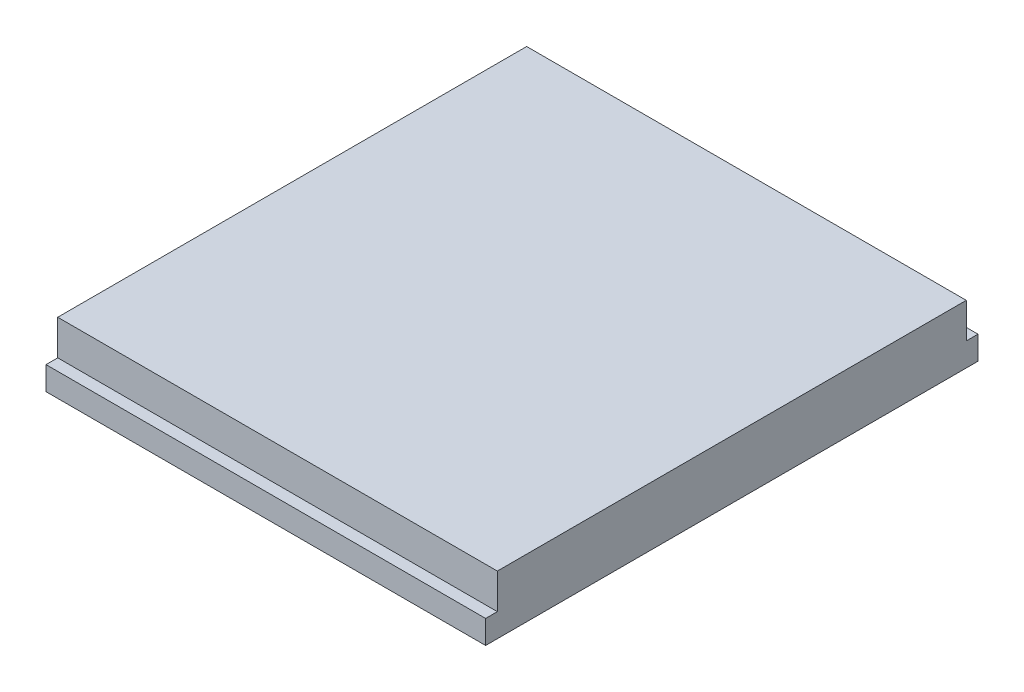
ISO-10303-21;
HEADER;
FILE_DESCRIPTION(('STEP AP214'),'2;1');
FILE_NAME('part.step','',(''),(''),'','','');
FILE_SCHEMA(('AUTOMOTIVE_DESIGN { 1 0 10303 214 1 1 1 1 }'));
ENDSEC;
DATA;
#1=APPLICATION_CONTEXT('core data for automotive mechanical design processes');
#2=APPLICATION_PROTOCOL_DEFINITION('international standard','automotive_design',2000,#1);
#3=PRODUCT_CONTEXT('',#1,'mechanical');
#4=PRODUCT('Part','Part','',(#3));
#5=PRODUCT_RELATED_PRODUCT_CATEGORY('part','',(#4));
#6=PRODUCT_DEFINITION_FORMATION('','',#4);
#7=PRODUCT_DEFINITION_CONTEXT('part definition',#1,'design');
#8=PRODUCT_DEFINITION('design','',#6,#7);
#9=PRODUCT_DEFINITION_SHAPE('','',#8);
#10=(LENGTH_UNIT() NAMED_UNIT(*) SI_UNIT(.MILLI.,.METRE.));
#11=(NAMED_UNIT(*) PLANE_ANGLE_UNIT() SI_UNIT($,.RADIAN.));
#12=(NAMED_UNIT(*) SI_UNIT($,.STERADIAN.) SOLID_ANGLE_UNIT());
#13=UNCERTAINTY_MEASURE_WITH_UNIT(LENGTH_MEASURE(1.E-05),#10,'distance_accuracy_value','');
#14=(GEOMETRIC_REPRESENTATION_CONTEXT(3) GLOBAL_UNCERTAINTY_ASSIGNED_CONTEXT((#13)) GLOBAL_UNIT_ASSIGNED_CONTEXT((#10,
#11,#12)) REPRESENTATION_CONTEXT('',''));
#15=CARTESIAN_POINT('',(0.,0.,0.));
#16=DIRECTION('',(0.,0.,1.));
#17=DIRECTION('',(1.,0.,0.));
#18=AXIS2_PLACEMENT_3D('',#15,#16,#17);
#19=CARTESIAN_POINT('',(-18.75,5.,-21.));
#20=DIRECTION('',(0.,0.,-1.));
#21=DIRECTION('',(-1.,0.,0.));
#22=AXIS2_PLACEMENT_3D('',#19,#20,#21);
#23=PLANE('',#22);
#24=DIRECTION('',(0.,-1.,0.));
#25=VECTOR('',#24,1.);
#26=CARTESIAN_POINT('',(-18.75,5.,-21.));
#27=LINE('',#26,#25);
#28=CARTESIAN_POINT('',(-18.75,2.,-21.));
#29=VERTEX_POINT('',#28);
#30=CARTESIAN_POINT('',(-18.75,0.,-21.));
#31=VERTEX_POINT('',#30);
#32=EDGE_CURVE('E156',#29,#31,#27,.T.);
#33=ORIENTED_EDGE('',*,*,#32,.F.);
#34=DIRECTION('',(-1.,0.,0.));
#35=VECTOR('',#34,1.);
#36=CARTESIAN_POINT('',(-18.75,2.,-21.));
#37=LINE('',#36,#35);
#38=CARTESIAN_POINT('',(18.75,2.,-21.));
#39=VERTEX_POINT('',#38);
#40=EDGE_CURVE('E109',#39,#29,#37,.T.);
#41=ORIENTED_EDGE('',*,*,#40,.F.);
#42=DIRECTION('',(0.,-1.,0.));
#43=VECTOR('',#42,1.);
#44=CARTESIAN_POINT('',(18.75,5.,-21.));
#45=LINE('',#44,#43);
#46=CARTESIAN_POINT('',(18.75,0.,-21.));
#47=VERTEX_POINT('',#46);
#48=EDGE_CURVE('E41',#39,#47,#45,.T.);
#49=ORIENTED_EDGE('',*,*,#48,.T.);
#50=DIRECTION('',(1.,0.,0.));
#51=VECTOR('',#50,1.);
#52=CARTESIAN_POINT('',(-18.75,0.,-21.));
#53=LINE('',#52,#51);
#54=EDGE_CURVE('E150',#31,#47,#53,.T.);
#55=ORIENTED_EDGE('',*,*,#54,.F.);
#56=EDGE_LOOP('',(#33,#41,#49,#55));
#57=FACE_BOUND('',#56,.T.);
#58=ADVANCED_FACE('F33',(#57),#23,.T.);
#59=CARTESIAN_POINT('',(-18.75,5.,21.));
#60=DIRECTION('',(0.,0.,-1.));
#61=DIRECTION('',(-1.,0.,0.));
#62=AXIS2_PLACEMENT_3D('',#59,#60,#61);
#63=PLANE('',#62);
#64=DIRECTION('',(0.,-1.,0.));
#65=VECTOR('',#64,1.);
#66=CARTESIAN_POINT('',(18.75,5.,21.));
#67=LINE('',#66,#65);
#68=CARTESIAN_POINT('',(18.75,2.,21.));
#69=VERTEX_POINT('',#68);
#70=CARTESIAN_POINT('',(18.75,0.,21.));
#71=VERTEX_POINT('',#70);
#72=EDGE_CURVE('E11',#69,#71,#67,.T.);
#73=ORIENTED_EDGE('',*,*,#72,.F.);
#74=DIRECTION('',(1.,0.,0.));
#75=VECTOR('',#74,1.);
#76=CARTESIAN_POINT('',(-18.75,2.,21.));
#77=LINE('',#76,#75);
#78=CARTESIAN_POINT('',(-18.75,2.,21.));
#79=VERTEX_POINT('',#78);
#80=EDGE_CURVE('E127',#79,#69,#77,.T.);
#81=ORIENTED_EDGE('',*,*,#80,.F.);
#82=DIRECTION('',(0.,-1.,0.));
#83=VECTOR('',#82,1.);
#84=CARTESIAN_POINT('',(-18.75,5.,21.));
#85=LINE('',#84,#83);
#86=CARTESIAN_POINT('',(-18.75,0.,21.));
#87=VERTEX_POINT('',#86);
#88=EDGE_CURVE('E144',#79,#87,#85,.T.);
#89=ORIENTED_EDGE('',*,*,#88,.T.);
#90=DIRECTION('',(1.,0.,0.));
#91=VECTOR('',#90,1.);
#92=CARTESIAN_POINT('',(-18.75,0.,21.));
#93=LINE('',#92,#91);
#94=EDGE_CURVE('E137',#87,#71,#93,.T.);
#95=ORIENTED_EDGE('',*,*,#94,.T.);
#96=EDGE_LOOP('',(#73,#81,#89,#95));
#97=FACE_BOUND('',#96,.T.);
#98=ADVANCED_FACE('F35',(#97),#63,.F.);
#99=CARTESIAN_POINT('',(18.75,5.,21.));
#100=DIRECTION('',(-1.,0.,0.));
#101=DIRECTION('',(0.,0.,1.));
#102=AXIS2_PLACEMENT_3D('',#99,#100,#101);
#103=PLANE('',#102);
#104=DIRECTION('',(0.,0.,-1.));
#105=VECTOR('',#104,1.);
#106=CARTESIAN_POINT('',(18.75,2.,-21.));
#107=LINE('',#106,#105);
#108=CARTESIAN_POINT('',(18.75,2.,-20.));
#109=VERTEX_POINT('',#108);
#110=EDGE_CURVE('E103',#109,#39,#107,.T.);
#111=ORIENTED_EDGE('',*,*,#110,.F.);
#112=DIRECTION('',(0.,1.,0.));
#113=VECTOR('',#112,1.);
#114=CARTESIAN_POINT('',(18.75,2.,-20.));
#115=LINE('',#114,#113);
#116=CARTESIAN_POINT('',(18.75,5.,-20.));
#117=VERTEX_POINT('',#116);
#118=EDGE_CURVE('E100',#109,#117,#115,.T.);
#119=ORIENTED_EDGE('',*,*,#118,.T.);
#120=DIRECTION('',(0.,0.,-1.));
#121=VECTOR('',#120,1.);
#122=CARTESIAN_POINT('',(18.75,5.,21.));
#123=LINE('',#122,#121);
#124=CARTESIAN_POINT('',(18.75,5.,20.));
#125=VERTEX_POINT('',#124);
#126=EDGE_CURVE('E139',#125,#117,#123,.T.);
#127=ORIENTED_EDGE('',*,*,#126,.F.);
#128=DIRECTION('',(0.,1.,0.));
#129=VECTOR('',#128,1.);
#130=CARTESIAN_POINT('',(18.75,2.,20.));
#131=LINE('',#130,#129);
#132=CARTESIAN_POINT('',(18.75,2.,20.));
#133=VERTEX_POINT('',#132);
#134=EDGE_CURVE('E56',#133,#125,#131,.T.);
#135=ORIENTED_EDGE('',*,*,#134,.F.);
#136=DIRECTION('',(0.,0.,-1.));
#137=VECTOR('',#136,1.);
#138=CARTESIAN_POINT('',(18.75,2.,21.));
#139=LINE('',#138,#137);
#140=EDGE_CURVE('E129',#69,#133,#139,.T.);
#141=ORIENTED_EDGE('',*,*,#140,.F.);
#142=ORIENTED_EDGE('',*,*,#72,.T.);
#143=DIRECTION('',(0.,0.,-1.));
#144=VECTOR('',#143,1.);
#145=CARTESIAN_POINT('',(18.75,0.,21.));
#146=LINE('',#145,#144);
#147=EDGE_CURVE('E147',#71,#47,#146,.T.);
#148=ORIENTED_EDGE('',*,*,#147,.T.);
#149=ORIENTED_EDGE('',*,*,#48,.F.);
#150=EDGE_LOOP('',(#111,#119,#127,#135,#141,#142,#148,#149));
#151=FACE_BOUND('',#150,.T.);
#152=ADVANCED_FACE('F162',(#151),#103,.F.);
#153=CARTESIAN_POINT('',(-18.75,5.,21.));
#154=DIRECTION('',(-1.,0.,0.));
#155=DIRECTION('',(0.,0.,1.));
#156=AXIS2_PLACEMENT_3D('',#153,#154,#155);
#157=PLANE('',#156);
#158=DIRECTION('',(0.,1.,0.));
#159=VECTOR('',#158,1.);
#160=CARTESIAN_POINT('',(-18.75,2.,-20.));
#161=LINE('',#160,#159);
#162=CARTESIAN_POINT('',(-18.75,2.,-20.));
#163=VERTEX_POINT('',#162);
#164=CARTESIAN_POINT('',(-18.75,5.,-20.));
#165=VERTEX_POINT('',#164);
#166=EDGE_CURVE('E48',#163,#165,#161,.T.);
#167=ORIENTED_EDGE('',*,*,#166,.F.);
#168=DIRECTION('',(0.,0.,1.));
#169=VECTOR('',#168,1.);
#170=CARTESIAN_POINT('',(-18.75,2.,-21.));
#171=LINE('',#170,#169);
#172=EDGE_CURVE('E104',#29,#163,#171,.T.);
#173=ORIENTED_EDGE('',*,*,#172,.F.);
#174=ORIENTED_EDGE('',*,*,#32,.T.);
#175=DIRECTION('',(0.,0.,-1.));
#176=VECTOR('',#175,1.);
#177=CARTESIAN_POINT('',(-18.75,0.,21.));
#178=LINE('',#177,#176);
#179=EDGE_CURVE('E142',#87,#31,#178,.T.);
#180=ORIENTED_EDGE('',*,*,#179,.F.);
#181=ORIENTED_EDGE('',*,*,#88,.F.);
#182=DIRECTION('',(0.,0.,1.));
#183=VECTOR('',#182,1.);
#184=CARTESIAN_POINT('',(-18.75,2.,21.));
#185=LINE('',#184,#183);
#186=CARTESIAN_POINT('',(-18.75,2.,20.));
#187=VERTEX_POINT('',#186);
#188=EDGE_CURVE('E125',#187,#79,#185,.T.);
#189=ORIENTED_EDGE('',*,*,#188,.F.);
#190=DIRECTION('',(0.,1.,0.));
#191=VECTOR('',#190,1.);
#192=CARTESIAN_POINT('',(-18.75,2.,20.));
#193=LINE('',#192,#191);
#194=CARTESIAN_POINT('',(-18.75,5.,20.));
#195=VERTEX_POINT('',#194);
#196=EDGE_CURVE('E135',#187,#195,#193,.T.);
#197=ORIENTED_EDGE('',*,*,#196,.T.);
#198=DIRECTION('',(0.,0.,-1.));
#199=VECTOR('',#198,1.);
#200=CARTESIAN_POINT('',(-18.75,5.,21.));
#201=LINE('',#200,#199);
#202=EDGE_CURVE('E118',#195,#165,#201,.T.);
#203=ORIENTED_EDGE('',*,*,#202,.T.);
#204=EDGE_LOOP('',(#167,#173,#174,#180,#181,#189,#197,#203));
#205=FACE_BOUND('',#204,.T.);
#206=ADVANCED_FACE('F115',(#205),#157,.T.);
#207=CARTESIAN_POINT('',(0.,5.,0.));
#208=DIRECTION('',(0.,1.,0.));
#209=DIRECTION('',(0.,0.,1.));
#210=AXIS2_PLACEMENT_3D('',#207,#208,#209);
#211=PLANE('',#210);
#212=DIRECTION('',(1.,0.,0.));
#213=VECTOR('',#212,1.);
#214=CARTESIAN_POINT('',(-18.75,5.,-20.));
#215=LINE('',#214,#213);
#216=EDGE_CURVE('E112',#165,#117,#215,.T.);
#217=ORIENTED_EDGE('',*,*,#216,.F.);
#218=ORIENTED_EDGE('',*,*,#202,.F.);
#219=DIRECTION('',(-1.,0.,0.));
#220=VECTOR('',#219,1.);
#221=CARTESIAN_POINT('',(-18.75,5.,20.));
#222=LINE('',#221,#220);
#223=EDGE_CURVE('E120',#125,#195,#222,.T.);
#224=ORIENTED_EDGE('',*,*,#223,.F.);
#225=ORIENTED_EDGE('',*,*,#126,.T.);
#226=EDGE_LOOP('',(#217,#218,#224,#225));
#227=FACE_BOUND('',#226,.T.);
#228=ADVANCED_FACE('F177',(#227),#211,.T.);
#229=CARTESIAN_POINT('',(0.,0.,0.));
#230=DIRECTION('',(0.,1.,0.));
#231=DIRECTION('',(0.,0.,1.));
#232=AXIS2_PLACEMENT_3D('',#229,#230,#231);
#233=PLANE('',#232);
#234=ORIENTED_EDGE('',*,*,#94,.F.);
#235=ORIENTED_EDGE('',*,*,#179,.T.);
#236=ORIENTED_EDGE('',*,*,#54,.T.);
#237=ORIENTED_EDGE('',*,*,#147,.F.);
#238=EDGE_LOOP('',(#234,#235,#236,#237));
#239=FACE_BOUND('',#238,.T.);
#240=ADVANCED_FACE('F167',(#239),#233,.F.);
#241=CARTESIAN_POINT('',(-18.75,2.,20.));
#242=DIRECTION('',(0.,0.,-1.));
#243=DIRECTION('',(-1.,0.,0.));
#244=AXIS2_PLACEMENT_3D('',#241,#242,#243);
#245=PLANE('',#244);
#246=ORIENTED_EDGE('',*,*,#223,.T.);
#247=ORIENTED_EDGE('',*,*,#196,.F.);
#248=DIRECTION('',(-1.,0.,0.));
#249=VECTOR('',#248,1.);
#250=CARTESIAN_POINT('',(-18.75,2.,20.));
#251=LINE('',#250,#249);
#252=EDGE_CURVE('E131',#133,#187,#251,.T.);
#253=ORIENTED_EDGE('',*,*,#252,.F.);
#254=ORIENTED_EDGE('',*,*,#134,.T.);
#255=EDGE_LOOP('',(#246,#247,#253,#254));
#256=FACE_BOUND('',#255,.T.);
#257=ADVANCED_FACE('F178',(#256),#245,.F.);
#258=CARTESIAN_POINT('',(0.,2.,0.));
#259=DIRECTION('',(0.,-1.,0.));
#260=DIRECTION('',(0.,0.,-1.));
#261=AXIS2_PLACEMENT_3D('',#258,#259,#260);
#262=PLANE('',#261);
#263=ORIENTED_EDGE('',*,*,#188,.T.);
#264=ORIENTED_EDGE('',*,*,#80,.T.);
#265=ORIENTED_EDGE('',*,*,#140,.T.);
#266=ORIENTED_EDGE('',*,*,#252,.T.);
#267=EDGE_LOOP('',(#263,#264,#265,#266));
#268=FACE_BOUND('',#267,.T.);
#269=ADVANCED_FACE('F174',(#268),#262,.F.);
#270=CARTESIAN_POINT('',(-18.75,2.,-20.));
#271=DIRECTION('',(0.,0.,1.));
#272=DIRECTION('',(1.,0.,0.));
#273=AXIS2_PLACEMENT_3D('',#270,#271,#272);
#274=PLANE('',#273);
#275=ORIENTED_EDGE('',*,*,#216,.T.);
#276=ORIENTED_EDGE('',*,*,#118,.F.);
#277=DIRECTION('',(1.,0.,0.));
#278=VECTOR('',#277,1.);
#279=CARTESIAN_POINT('',(-18.75,2.,-20.));
#280=LINE('',#279,#278);
#281=EDGE_CURVE('E96',#163,#109,#280,.T.);
#282=ORIENTED_EDGE('',*,*,#281,.F.);
#283=ORIENTED_EDGE('',*,*,#166,.T.);
#284=EDGE_LOOP('',(#275,#276,#282,#283));
#285=FACE_BOUND('',#284,.T.);
#286=ADVANCED_FACE('F98',(#285),#274,.F.);
#287=CARTESIAN_POINT('',(0.,2.,0.));
#288=DIRECTION('',(0.,1.,0.));
#289=DIRECTION('',(0.,0.,1.));
#290=AXIS2_PLACEMENT_3D('',#287,#288,#289);
#291=PLANE('',#290);
#292=ORIENTED_EDGE('',*,*,#172,.T.);
#293=ORIENTED_EDGE('',*,*,#281,.T.);
#294=ORIENTED_EDGE('',*,*,#110,.T.);
#295=ORIENTED_EDGE('',*,*,#40,.T.);
#296=EDGE_LOOP('',(#292,#293,#294,#295));
#297=FACE_BOUND('',#296,.T.);
#298=ADVANCED_FACE('F107',(#297),#291,.T.);
#299=CLOSED_SHELL('',(#58,#98,#152,#206,#228,#240,#257,#269,#286,#298));
#300=MANIFOLD_SOLID_BREP('B2',#299);
#301=ADVANCED_BREP_SHAPE_REPRESENTATION('',(#18,#300),#14);
#302=SHAPE_DEFINITION_REPRESENTATION(#9,#301);
ENDSEC;
END-ISO-10303-21;
